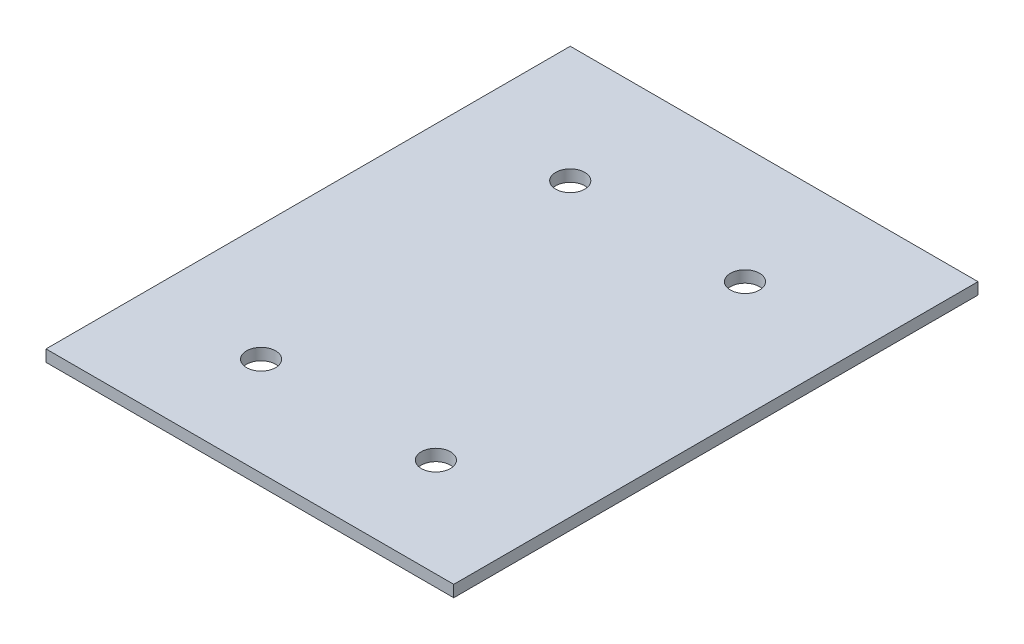
ISO-10303-21;
HEADER;
FILE_DESCRIPTION(('STEP AP214'),'2;1');
FILE_NAME('part.step','',(''),(''),'','','');
FILE_SCHEMA(('AUTOMOTIVE_DESIGN { 1 0 10303 214 1 1 1 1 }'));
ENDSEC;
DATA;
#1=APPLICATION_CONTEXT('core data for automotive mechanical design processes');
#2=APPLICATION_PROTOCOL_DEFINITION('international standard','automotive_design',2000,#1);
#3=PRODUCT_CONTEXT('',#1,'mechanical');
#4=PRODUCT('Part','Part','',(#3));
#5=PRODUCT_RELATED_PRODUCT_CATEGORY('part','',(#4));
#6=PRODUCT_DEFINITION_FORMATION('','',#4);
#7=PRODUCT_DEFINITION_CONTEXT('part definition',#1,'design');
#8=PRODUCT_DEFINITION('design','',#6,#7);
#9=PRODUCT_DEFINITION_SHAPE('','',#8);
#10=(LENGTH_UNIT() NAMED_UNIT(*) SI_UNIT(.MILLI.,.METRE.));
#11=(NAMED_UNIT(*) PLANE_ANGLE_UNIT() SI_UNIT($,.RADIAN.));
#12=(NAMED_UNIT(*) SI_UNIT($,.STERADIAN.) SOLID_ANGLE_UNIT());
#13=UNCERTAINTY_MEASURE_WITH_UNIT(LENGTH_MEASURE(1.E-05),#10,'distance_accuracy_value','');
#14=(GEOMETRIC_REPRESENTATION_CONTEXT(3) GLOBAL_UNCERTAINTY_ASSIGNED_CONTEXT((#13)) GLOBAL_UNIT_ASSIGNED_CONTEXT((#10,
#11,#12)) REPRESENTATION_CONTEXT('',''));
#15=CARTESIAN_POINT('',(0.,0.,0.));
#16=DIRECTION('',(0.,0.,1.));
#17=DIRECTION('',(1.,0.,0.));
#18=AXIS2_PLACEMENT_3D('',#15,#16,#17);
#19=CARTESIAN_POINT('',(0.,2.,0.));
#20=DIRECTION('',(0.,1.,0.));
#21=DIRECTION('',(0.,0.,1.));
#22=AXIS2_PLACEMENT_3D('',#19,#20,#21);
#23=PLANE('',#22);
#24=CARTESIAN_POINT('',(-15.,2.,28.0714285714286));
#25=DIRECTION('',(0.,1.,0.));
#26=DIRECTION('',(0.,0.,1.));
#27=AXIS2_PLACEMENT_3D('',#24,#25,#26);
#28=CIRCLE('',#27,2.5);
#29=CARTESIAN_POINT('',(-15.,2.,30.5714285714286));
#30=VERTEX_POINT('',#29);
#31=EDGE_CURVE('E121',#30,#30,#28,.T.);
#32=ORIENTED_EDGE('',*,*,#31,.F.);
#33=EDGE_LOOP('',(#32));
#34=FACE_BOUND('',#33,.T.);
#35=CARTESIAN_POINT('',(-15.,2.,-25.));
#36=DIRECTION('',(0.,1.,0.));
#37=DIRECTION('',(0.,0.,1.));
#38=AXIS2_PLACEMENT_3D('',#35,#36,#37);
#39=CIRCLE('',#38,2.5);
#40=CARTESIAN_POINT('',(-15.,2.,-22.5));
#41=VERTEX_POINT('',#40);
#42=EDGE_CURVE('E100',#41,#41,#39,.T.);
#43=ORIENTED_EDGE('',*,*,#42,.F.);
#44=EDGE_LOOP('',(#43));
#45=FACE_BOUND('',#44,.T.);
#46=DIRECTION('',(0.,0.,-1.));
#47=VECTOR('',#46,1.);
#48=CARTESIAN_POINT('',(35.,2.,-45.));
#49=LINE('',#48,#47);
#50=CARTESIAN_POINT('',(35.,2.,45.));
#51=VERTEX_POINT('',#50);
#52=CARTESIAN_POINT('',(35.,2.,-45.));
#53=VERTEX_POINT('',#52);
#54=EDGE_CURVE('E85',#51,#53,#49,.T.);
#55=ORIENTED_EDGE('',*,*,#54,.T.);
#56=DIRECTION('',(-1.,0.,0.));
#57=VECTOR('',#56,1.);
#58=CARTESIAN_POINT('',(-35.,2.,-45.));
#59=LINE('',#58,#57);
#60=CARTESIAN_POINT('',(-35.,2.,-45.));
#61=VERTEX_POINT('',#60);
#62=EDGE_CURVE('E80',#53,#61,#59,.T.);
#63=ORIENTED_EDGE('',*,*,#62,.T.);
#64=DIRECTION('',(0.,0.,1.));
#65=VECTOR('',#64,1.);
#66=CARTESIAN_POINT('',(-35.,2.,-45.));
#67=LINE('',#66,#65);
#68=CARTESIAN_POINT('',(-35.,2.,45.));
#69=VERTEX_POINT('',#68);
#70=EDGE_CURVE('E83',#61,#69,#67,.T.);
#71=ORIENTED_EDGE('',*,*,#70,.T.);
#72=DIRECTION('',(1.,0.,0.));
#73=VECTOR('',#72,1.);
#74=CARTESIAN_POINT('',(-35.,2.,45.));
#75=LINE('',#74,#73);
#76=EDGE_CURVE('E50',#69,#51,#75,.T.);
#77=ORIENTED_EDGE('',*,*,#76,.T.);
#78=EDGE_LOOP('',(#55,#63,#71,#77));
#79=FACE_BOUND('',#78,.T.);
#80=CARTESIAN_POINT('',(15.,2.,-25.));
#81=DIRECTION('',(0.,1.,0.));
#82=DIRECTION('',(0.,0.,1.));
#83=AXIS2_PLACEMENT_3D('',#80,#81,#82);
#84=CIRCLE('',#83,2.5);
#85=CARTESIAN_POINT('',(15.,2.,-22.5));
#86=VERTEX_POINT('',#85);
#87=EDGE_CURVE('E115',#86,#86,#84,.T.);
#88=ORIENTED_EDGE('',*,*,#87,.F.);
#89=EDGE_LOOP('',(#88));
#90=FACE_BOUND('',#89,.T.);
#91=CARTESIAN_POINT('',(15.,2.,28.0714285714286));
#92=DIRECTION('',(0.,1.,0.));
#93=DIRECTION('',(0.,0.,1.));
#94=AXIS2_PLACEMENT_3D('',#91,#92,#93);
#95=CIRCLE('',#94,2.5);
#96=CARTESIAN_POINT('',(15.,2.,30.5714285714286));
#97=VERTEX_POINT('',#96);
#98=EDGE_CURVE('E127',#97,#97,#95,.T.);
#99=ORIENTED_EDGE('',*,*,#98,.F.);
#100=EDGE_LOOP('',(#99));
#101=FACE_BOUND('',#100,.T.);
#102=ADVANCED_FACE('F33',(#34,#45,#79,#90,#101),#23,.T.);
#103=CARTESIAN_POINT('',(0.,0.,0.));
#104=DIRECTION('',(0.,1.,0.));
#105=DIRECTION('',(0.,0.,1.));
#106=AXIS2_PLACEMENT_3D('',#103,#104,#105);
#107=PLANE('',#106);
#108=DIRECTION('',(0.,0.,-1.));
#109=VECTOR('',#108,1.);
#110=CARTESIAN_POINT('',(35.,0.,-45.));
#111=LINE('',#110,#109);
#112=CARTESIAN_POINT('',(35.,0.,45.));
#113=VERTEX_POINT('',#112);
#114=CARTESIAN_POINT('',(35.,0.,-45.));
#115=VERTEX_POINT('',#114);
#116=EDGE_CURVE('E97',#113,#115,#111,.T.);
#117=ORIENTED_EDGE('',*,*,#116,.F.);
#118=DIRECTION('',(1.,0.,0.));
#119=VECTOR('',#118,1.);
#120=CARTESIAN_POINT('',(-35.,0.,45.));
#121=LINE('',#120,#119);
#122=CARTESIAN_POINT('',(-35.,0.,45.));
#123=VERTEX_POINT('',#122);
#124=EDGE_CURVE('E73',#123,#113,#121,.T.);
#125=ORIENTED_EDGE('',*,*,#124,.F.);
#126=DIRECTION('',(0.,0.,1.));
#127=VECTOR('',#126,1.);
#128=CARTESIAN_POINT('',(-35.,0.,-45.));
#129=LINE('',#128,#127);
#130=CARTESIAN_POINT('',(-35.,0.,-45.));
#131=VERTEX_POINT('',#130);
#132=EDGE_CURVE('E67',#131,#123,#129,.T.);
#133=ORIENTED_EDGE('',*,*,#132,.F.);
#134=DIRECTION('',(-1.,0.,0.));
#135=VECTOR('',#134,1.);
#136=CARTESIAN_POINT('',(-35.,0.,-45.));
#137=LINE('',#136,#135);
#138=EDGE_CURVE('E89',#115,#131,#137,.T.);
#139=ORIENTED_EDGE('',*,*,#138,.F.);
#140=EDGE_LOOP('',(#117,#125,#133,#139));
#141=FACE_BOUND('',#140,.T.);
#142=CARTESIAN_POINT('',(-15.,0.,-25.));
#143=DIRECTION('',(0.,1.,0.));
#144=DIRECTION('',(0.,0.,1.));
#145=AXIS2_PLACEMENT_3D('',#142,#143,#144);
#146=CIRCLE('',#145,2.5);
#147=CARTESIAN_POINT('',(-15.,0.,-22.5));
#148=VERTEX_POINT('',#147);
#149=EDGE_CURVE('E112',#148,#148,#146,.T.);
#150=ORIENTED_EDGE('',*,*,#149,.T.);
#151=EDGE_LOOP('',(#150));
#152=FACE_BOUND('',#151,.T.);
#153=CARTESIAN_POINT('',(15.,0.,-25.));
#154=DIRECTION('',(0.,1.,0.));
#155=DIRECTION('',(0.,0.,1.));
#156=AXIS2_PLACEMENT_3D('',#153,#154,#155);
#157=CIRCLE('',#156,2.5);
#158=CARTESIAN_POINT('',(15.,0.,-22.5));
#159=VERTEX_POINT('',#158);
#160=EDGE_CURVE('E118',#159,#159,#157,.T.);
#161=ORIENTED_EDGE('',*,*,#160,.T.);
#162=EDGE_LOOP('',(#161));
#163=FACE_BOUND('',#162,.T.);
#164=CARTESIAN_POINT('',(-15.,0.,28.0714285714286));
#165=DIRECTION('',(0.,1.,0.));
#166=DIRECTION('',(0.,0.,1.));
#167=AXIS2_PLACEMENT_3D('',#164,#165,#166);
#168=CIRCLE('',#167,2.5);
#169=CARTESIAN_POINT('',(-15.,0.,30.5714285714286));
#170=VERTEX_POINT('',#169);
#171=EDGE_CURVE('E124',#170,#170,#168,.T.);
#172=ORIENTED_EDGE('',*,*,#171,.T.);
#173=EDGE_LOOP('',(#172));
#174=FACE_BOUND('',#173,.T.);
#175=CARTESIAN_POINT('',(15.,0.,28.0714285714286));
#176=DIRECTION('',(0.,1.,0.));
#177=DIRECTION('',(0.,0.,1.));
#178=AXIS2_PLACEMENT_3D('',#175,#176,#177);
#179=CIRCLE('',#178,2.5);
#180=CARTESIAN_POINT('',(15.,0.,30.5714285714286));
#181=VERTEX_POINT('',#180);
#182=EDGE_CURVE('E130',#181,#181,#179,.T.);
#183=ORIENTED_EDGE('',*,*,#182,.T.);
#184=EDGE_LOOP('',(#183));
#185=FACE_BOUND('',#184,.T.);
#186=ADVANCED_FACE('F108',(#141,#152,#163,#174,#185),#107,.F.);
#187=CARTESIAN_POINT('',(35.,2.,-45.));
#188=DIRECTION('',(-1.,0.,0.));
#189=DIRECTION('',(0.,0.,1.));
#190=AXIS2_PLACEMENT_3D('',#187,#188,#189);
#191=PLANE('',#190);
#192=ORIENTED_EDGE('',*,*,#116,.T.);
#193=DIRECTION('',(0.,-1.,0.));
#194=VECTOR('',#193,1.);
#195=CARTESIAN_POINT('',(35.,2.,-45.));
#196=LINE('',#195,#194);
#197=EDGE_CURVE('E11',#53,#115,#196,.T.);
#198=ORIENTED_EDGE('',*,*,#197,.F.);
#199=ORIENTED_EDGE('',*,*,#54,.F.);
#200=DIRECTION('',(0.,-1.,0.));
#201=VECTOR('',#200,1.);
#202=CARTESIAN_POINT('',(35.,2.,45.));
#203=LINE('',#202,#201);
#204=EDGE_CURVE('E93',#51,#113,#203,.T.);
#205=ORIENTED_EDGE('',*,*,#204,.T.);
#206=EDGE_LOOP('',(#192,#198,#199,#205));
#207=FACE_BOUND('',#206,.T.);
#208=ADVANCED_FACE('F35',(#207),#191,.F.);
#209=CARTESIAN_POINT('',(-35.,2.,-45.));
#210=DIRECTION('',(0.,0.,1.));
#211=DIRECTION('',(1.,0.,0.));
#212=AXIS2_PLACEMENT_3D('',#209,#210,#211);
#213=PLANE('',#212);
#214=ORIENTED_EDGE('',*,*,#138,.T.);
#215=DIRECTION('',(0.,-1.,0.));
#216=VECTOR('',#215,1.);
#217=CARTESIAN_POINT('',(-35.,2.,-45.));
#218=LINE('',#217,#216);
#219=EDGE_CURVE('E42',#61,#131,#218,.T.);
#220=ORIENTED_EDGE('',*,*,#219,.F.);
#221=ORIENTED_EDGE('',*,*,#62,.F.);
#222=ORIENTED_EDGE('',*,*,#197,.T.);
#223=EDGE_LOOP('',(#214,#220,#221,#222));
#224=FACE_BOUND('',#223,.T.);
#225=ADVANCED_FACE('F88',(#224),#213,.F.);
#226=CARTESIAN_POINT('',(-35.,2.,-45.));
#227=DIRECTION('',(1.,0.,0.));
#228=DIRECTION('',(0.,0.,-1.));
#229=AXIS2_PLACEMENT_3D('',#226,#227,#228);
#230=PLANE('',#229);
#231=ORIENTED_EDGE('',*,*,#132,.T.);
#232=DIRECTION('',(0.,-1.,0.));
#233=VECTOR('',#232,1.);
#234=CARTESIAN_POINT('',(-35.,2.,45.));
#235=LINE('',#234,#233);
#236=EDGE_CURVE('E90',#69,#123,#235,.T.);
#237=ORIENTED_EDGE('',*,*,#236,.F.);
#238=ORIENTED_EDGE('',*,*,#70,.F.);
#239=ORIENTED_EDGE('',*,*,#219,.T.);
#240=EDGE_LOOP('',(#231,#237,#238,#239));
#241=FACE_BOUND('',#240,.T.);
#242=ADVANCED_FACE('F91',(#241),#230,.F.);
#243=CARTESIAN_POINT('',(-35.,2.,45.));
#244=DIRECTION('',(0.,0.,-1.));
#245=DIRECTION('',(-1.,0.,0.));
#246=AXIS2_PLACEMENT_3D('',#243,#244,#245);
#247=PLANE('',#246);
#248=ORIENTED_EDGE('',*,*,#124,.T.);
#249=ORIENTED_EDGE('',*,*,#204,.F.);
#250=ORIENTED_EDGE('',*,*,#76,.F.);
#251=ORIENTED_EDGE('',*,*,#236,.T.);
#252=EDGE_LOOP('',(#248,#249,#250,#251));
#253=FACE_BOUND('',#252,.T.);
#254=ADVANCED_FACE('F105',(#253),#247,.F.);
#255=CARTESIAN_POINT('',(-15.,2.,-25.));
#256=DIRECTION('',(0.,-1.,0.));
#257=DIRECTION('',(0.,0.,-1.));
#258=AXIS2_PLACEMENT_3D('',#255,#256,#257);
#259=CYLINDRICAL_SURFACE('',#258,2.5);
#260=ORIENTED_EDGE('',*,*,#42,.T.);
#261=EDGE_LOOP('',(#260));
#262=FACE_BOUND('',#261,.T.);
#263=ORIENTED_EDGE('',*,*,#149,.F.);
#264=EDGE_LOOP('',(#263));
#265=FACE_BOUND('',#264,.T.);
#266=ADVANCED_FACE('F149',(#262,#265),#259,.F.);
#267=CARTESIAN_POINT('',(15.,2.,-25.));
#268=DIRECTION('',(0.,-1.,0.));
#269=DIRECTION('',(0.,0.,-1.));
#270=AXIS2_PLACEMENT_3D('',#267,#268,#269);
#271=CYLINDRICAL_SURFACE('',#270,2.5);
#272=ORIENTED_EDGE('',*,*,#87,.T.);
#273=EDGE_LOOP('',(#272));
#274=FACE_BOUND('',#273,.T.);
#275=ORIENTED_EDGE('',*,*,#160,.F.);
#276=EDGE_LOOP('',(#275));
#277=FACE_BOUND('',#276,.T.);
#278=ADVANCED_FACE('F195',(#274,#277),#271,.F.);
#279=CARTESIAN_POINT('',(-15.,2.,28.0714285714286));
#280=DIRECTION('',(0.,-1.,0.));
#281=DIRECTION('',(0.,0.,-1.));
#282=AXIS2_PLACEMENT_3D('',#279,#280,#281);
#283=CYLINDRICAL_SURFACE('',#282,2.5);
#284=ORIENTED_EDGE('',*,*,#31,.T.);
#285=EDGE_LOOP('',(#284));
#286=FACE_BOUND('',#285,.T.);
#287=ORIENTED_EDGE('',*,*,#171,.F.);
#288=EDGE_LOOP('',(#287));
#289=FACE_BOUND('',#288,.T.);
#290=ADVANCED_FACE('F203',(#286,#289),#283,.F.);
#291=CARTESIAN_POINT('',(15.,2.,28.0714285714286));
#292=DIRECTION('',(0.,-1.,0.));
#293=DIRECTION('',(0.,0.,-1.));
#294=AXIS2_PLACEMENT_3D('',#291,#292,#293);
#295=CYLINDRICAL_SURFACE('',#294,2.5);
#296=ORIENTED_EDGE('',*,*,#98,.T.);
#297=EDGE_LOOP('',(#296));
#298=FACE_BOUND('',#297,.T.);
#299=ORIENTED_EDGE('',*,*,#182,.F.);
#300=EDGE_LOOP('',(#299));
#301=FACE_BOUND('',#300,.T.);
#302=ADVANCED_FACE('F136',(#298,#301),#295,.F.);
#303=CLOSED_SHELL('',(#102,#186,#208,#225,#242,#254,#266,#278,#290,#302));
#304=MANIFOLD_SOLID_BREP('B2',#303);
#305=ADVANCED_BREP_SHAPE_REPRESENTATION('',(#18,#304),#14);
#306=SHAPE_DEFINITION_REPRESENTATION(#9,#305);
ENDSEC;
END-ISO-10303-21;
